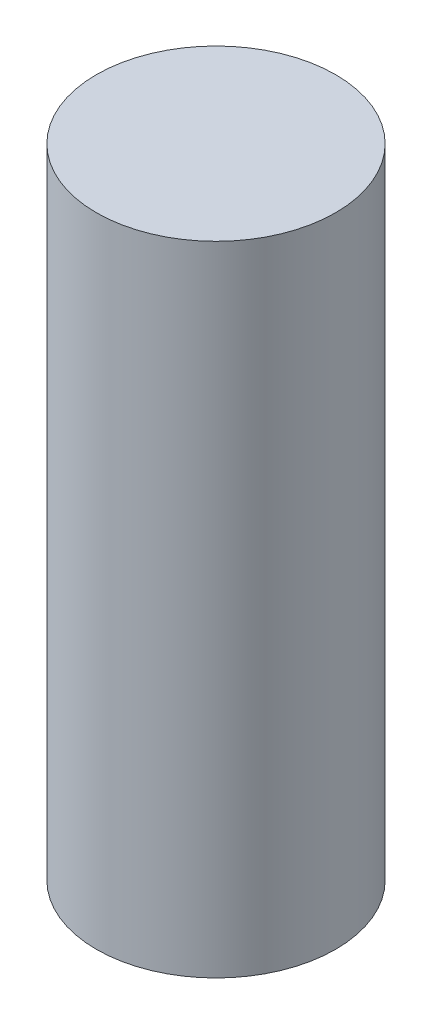
ISO-10303-21;
HEADER;
FILE_DESCRIPTION(('STEP AP214'),'2;1');
FILE_NAME('part.step','',(''),(''),'','','');
FILE_SCHEMA(('AUTOMOTIVE_DESIGN { 1 0 10303 214 1 1 1 1 }'));
ENDSEC;
DATA;
#1=APPLICATION_CONTEXT('core data for automotive mechanical design processes');
#2=APPLICATION_PROTOCOL_DEFINITION('international standard','automotive_design',2000,#1);
#3=PRODUCT_CONTEXT('',#1,'mechanical');
#4=PRODUCT('Part','Part','',(#3));
#5=PRODUCT_RELATED_PRODUCT_CATEGORY('part','',(#4));
#6=PRODUCT_DEFINITION_FORMATION('','',#4);
#7=PRODUCT_DEFINITION_CONTEXT('part definition',#1,'design');
#8=PRODUCT_DEFINITION('design','',#6,#7);
#9=PRODUCT_DEFINITION_SHAPE('','',#8);
#10=(LENGTH_UNIT() NAMED_UNIT(*) SI_UNIT(.MILLI.,.METRE.));
#11=(NAMED_UNIT(*) PLANE_ANGLE_UNIT() SI_UNIT($,.RADIAN.));
#12=(NAMED_UNIT(*) SI_UNIT($,.STERADIAN.) SOLID_ANGLE_UNIT());
#13=UNCERTAINTY_MEASURE_WITH_UNIT(LENGTH_MEASURE(1.E-05),#10,'distance_accuracy_value','');
#14=(GEOMETRIC_REPRESENTATION_CONTEXT(3) GLOBAL_UNCERTAINTY_ASSIGNED_CONTEXT((#13)) GLOBAL_UNIT_ASSIGNED_CONTEXT((#10,
#11,#12)) REPRESENTATION_CONTEXT('',''));
#15=CARTESIAN_POINT('',(0.,0.,0.));
#16=DIRECTION('',(0.,0.,1.));
#17=DIRECTION('',(1.,0.,0.));
#18=AXIS2_PLACEMENT_3D('',#15,#16,#17);
#19=CARTESIAN_POINT('',(0.,10.8,0.));
#20=DIRECTION('',(0.,-1.,0.));
#21=DIRECTION('',(0.,0.,-1.));
#22=AXIS2_PLACEMENT_3D('',#19,#20,#21);
#23=CYLINDRICAL_SURFACE('',#22,1.8);
#24=CARTESIAN_POINT('',(0.,10.8,0.));
#25=DIRECTION('',(0.,1.,0.));
#26=DIRECTION('',(0.,0.,1.));
#27=AXIS2_PLACEMENT_3D('',#24,#25,#26);
#28=CIRCLE('',#27,1.8);
#29=CARTESIAN_POINT('',(0.,10.8,1.8));
#30=VERTEX_POINT('',#29);
#31=EDGE_CURVE('E11',#30,#30,#28,.T.);
#32=ORIENTED_EDGE('',*,*,#31,.F.);
#33=EDGE_LOOP('',(#32));
#34=FACE_BOUND('',#33,.T.);
#35=CARTESIAN_POINT('',(0.,1.2,0.));
#36=DIRECTION('',(0.,1.,0.));
#37=DIRECTION('',(0.,0.,1.));
#38=AXIS2_PLACEMENT_3D('',#35,#36,#37);
#39=CIRCLE('',#38,1.8);
#40=CARTESIAN_POINT('',(0.,1.2,1.8));
#41=VERTEX_POINT('',#40);
#42=EDGE_CURVE('E47',#41,#41,#39,.T.);
#43=ORIENTED_EDGE('',*,*,#42,.T.);
#44=EDGE_LOOP('',(#43));
#45=FACE_BOUND('',#44,.T.);
#46=ADVANCED_FACE('F44',(#34,#45),#23,.T.);
#47=CARTESIAN_POINT('',(0.,10.8,0.));
#48=DIRECTION('',(0.,1.,0.));
#49=DIRECTION('',(0.,0.,1.));
#50=AXIS2_PLACEMENT_3D('',#47,#48,#49);
#51=PLANE('',#50);
#52=ORIENTED_EDGE('',*,*,#31,.T.);
#53=EDGE_LOOP('',(#52));
#54=FACE_BOUND('',#53,.T.);
#55=ADVANCED_FACE('F61',(#54),#51,.T.);
#56=CARTESIAN_POINT('',(0.,1.2,0.));
#57=DIRECTION('',(0.,1.,0.));
#58=DIRECTION('',(0.,0.,1.));
#59=AXIS2_PLACEMENT_3D('',#56,#57,#58);
#60=PLANE('',#59);
#61=ORIENTED_EDGE('',*,*,#42,.F.);
#62=EDGE_LOOP('',(#61));
#63=FACE_BOUND('',#62,.T.);
#64=ADVANCED_FACE('F59',(#63),#60,.F.);
#65=CLOSED_SHELL('',(#46,#55,#64));
#66=MANIFOLD_SOLID_BREP('B2',#65);
#67=ADVANCED_BREP_SHAPE_REPRESENTATION('',(#18,#66),#14);
#68=SHAPE_DEFINITION_REPRESENTATION(#9,#67);
ENDSEC;
END-ISO-10303-21;
